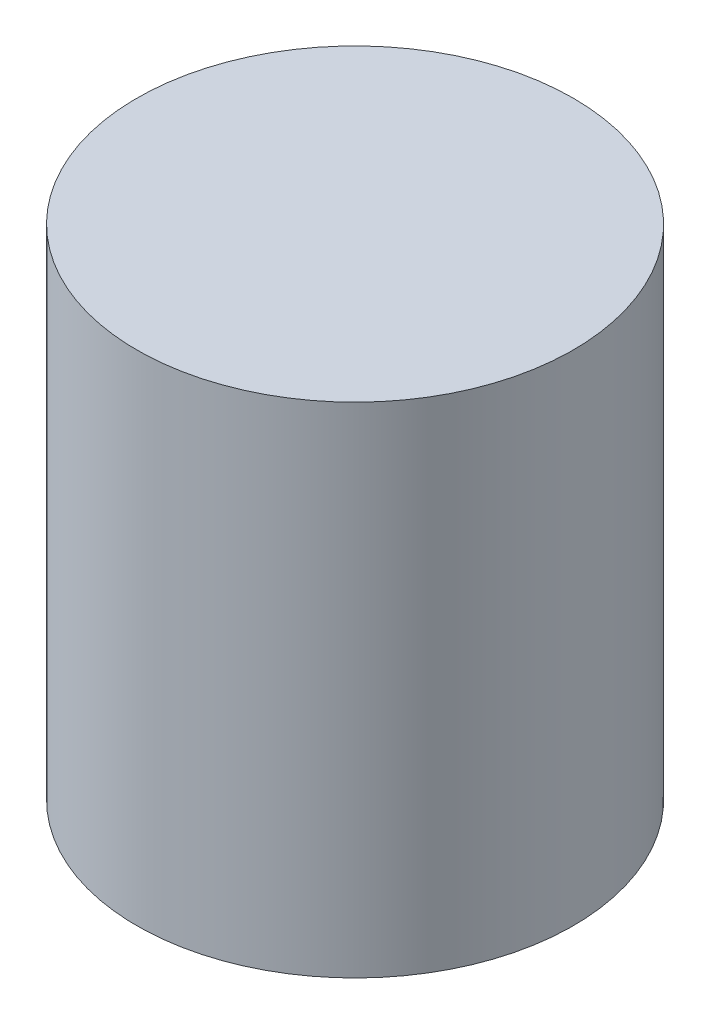
ISO-10303-21;
HEADER;
FILE_DESCRIPTION(('STEP AP214'),'2;1');
FILE_NAME('part.step','',(''),(''),'','','');
FILE_SCHEMA(('AUTOMOTIVE_DESIGN { 1 0 10303 214 1 1 1 1 }'));
ENDSEC;
DATA;
#1=APPLICATION_CONTEXT('core data for automotive mechanical design processes');
#2=APPLICATION_PROTOCOL_DEFINITION('international standard','automotive_design',2000,#1);
#3=PRODUCT_CONTEXT('',#1,'mechanical');
#4=PRODUCT('Part','Part','',(#3));
#5=PRODUCT_RELATED_PRODUCT_CATEGORY('part','',(#4));
#6=PRODUCT_DEFINITION_FORMATION('','',#4);
#7=PRODUCT_DEFINITION_CONTEXT('part definition',#1,'design');
#8=PRODUCT_DEFINITION('design','',#6,#7);
#9=PRODUCT_DEFINITION_SHAPE('','',#8);
#10=(LENGTH_UNIT() NAMED_UNIT(*) SI_UNIT(.MILLI.,.METRE.));
#11=(NAMED_UNIT(*) PLANE_ANGLE_UNIT() SI_UNIT($,.RADIAN.));
#12=(NAMED_UNIT(*) SI_UNIT($,.STERADIAN.) SOLID_ANGLE_UNIT());
#13=UNCERTAINTY_MEASURE_WITH_UNIT(LENGTH_MEASURE(1.E-05),#10,'distance_accuracy_value','');
#14=(GEOMETRIC_REPRESENTATION_CONTEXT(3) GLOBAL_UNCERTAINTY_ASSIGNED_CONTEXT((#13)) GLOBAL_UNIT_ASSIGNED_CONTEXT((#10,
#11,#12)) REPRESENTATION_CONTEXT('',''));
#15=CARTESIAN_POINT('',(0.,0.,0.));
#16=DIRECTION('',(0.,0.,1.));
#17=DIRECTION('',(1.,0.,0.));
#18=AXIS2_PLACEMENT_3D('',#15,#16,#17);
#19=CARTESIAN_POINT('',(1.75,0.,0.));
#20=DIRECTION('',(0.,-1.,0.));
#21=DIRECTION('',(0.,0.,-1.));
#22=AXIS2_PLACEMENT_3D('',#19,#20,#21);
#23=PLANE('',#22);
#24=CARTESIAN_POINT('',(0.,0.,0.));
#25=DIRECTION('',(0.,-1.,0.));
#26=DIRECTION('',(0.,0.,-1.));
#27=AXIS2_PLACEMENT_3D('',#24,#25,#26);
#28=CIRCLE('',#27,3.5);
#29=CARTESIAN_POINT('',(0.,0.,-3.5));
#30=VERTEX_POINT('',#29);
#31=EDGE_CURVE('E18',#30,#30,#28,.F.);
#32=ORIENTED_EDGE('',*,*,#31,.F.);
#33=EDGE_LOOP('',(#32));
#34=FACE_BOUND('',#33,.T.);
#35=ADVANCED_FACE('F15',(#34),#23,.T.);
#36=CARTESIAN_POINT('',(1.75,8.,0.));
#37=DIRECTION('',(0.,1.,0.));
#38=DIRECTION('',(0.,0.,1.));
#39=AXIS2_PLACEMENT_3D('',#36,#37,#38);
#40=PLANE('',#39);
#41=CARTESIAN_POINT('',(0.,8.,0.));
#42=DIRECTION('',(0.,-1.,0.));
#43=DIRECTION('',(0.,0.,-1.));
#44=AXIS2_PLACEMENT_3D('',#41,#42,#43);
#45=CIRCLE('',#44,3.5);
#46=CARTESIAN_POINT('',(0.,8.,-3.5));
#47=VERTEX_POINT('',#46);
#48=EDGE_CURVE('E10',#47,#47,#45,.T.);
#49=ORIENTED_EDGE('',*,*,#48,.F.);
#50=EDGE_LOOP('',(#49));
#51=FACE_BOUND('',#50,.T.);
#52=ADVANCED_FACE('F30',(#51),#40,.T.);
#53=CARTESIAN_POINT('',(0.,4.,0.));
#54=DIRECTION('',(0.,-1.,0.));
#55=DIRECTION('',(0.,0.,-1.));
#56=AXIS2_PLACEMENT_3D('',#53,#54,#55);
#57=CYLINDRICAL_SURFACE('',#56,3.5);
#58=ORIENTED_EDGE('',*,*,#48,.T.);
#59=EDGE_LOOP('',(#58));
#60=FACE_BOUND('',#59,.T.);
#61=ORIENTED_EDGE('',*,*,#31,.T.);
#62=EDGE_LOOP('',(#61));
#63=FACE_BOUND('',#62,.T.);
#64=ADVANCED_FACE('F27',(#60,#63),#57,.T.);
#65=CLOSED_SHELL('',(#35,#52,#64));
#66=MANIFOLD_SOLID_BREP('B1',#65);
#67=ADVANCED_BREP_SHAPE_REPRESENTATION('',(#18,#66),#14);
#68=SHAPE_DEFINITION_REPRESENTATION(#9,#67);
ENDSEC;
END-ISO-10303-21;
